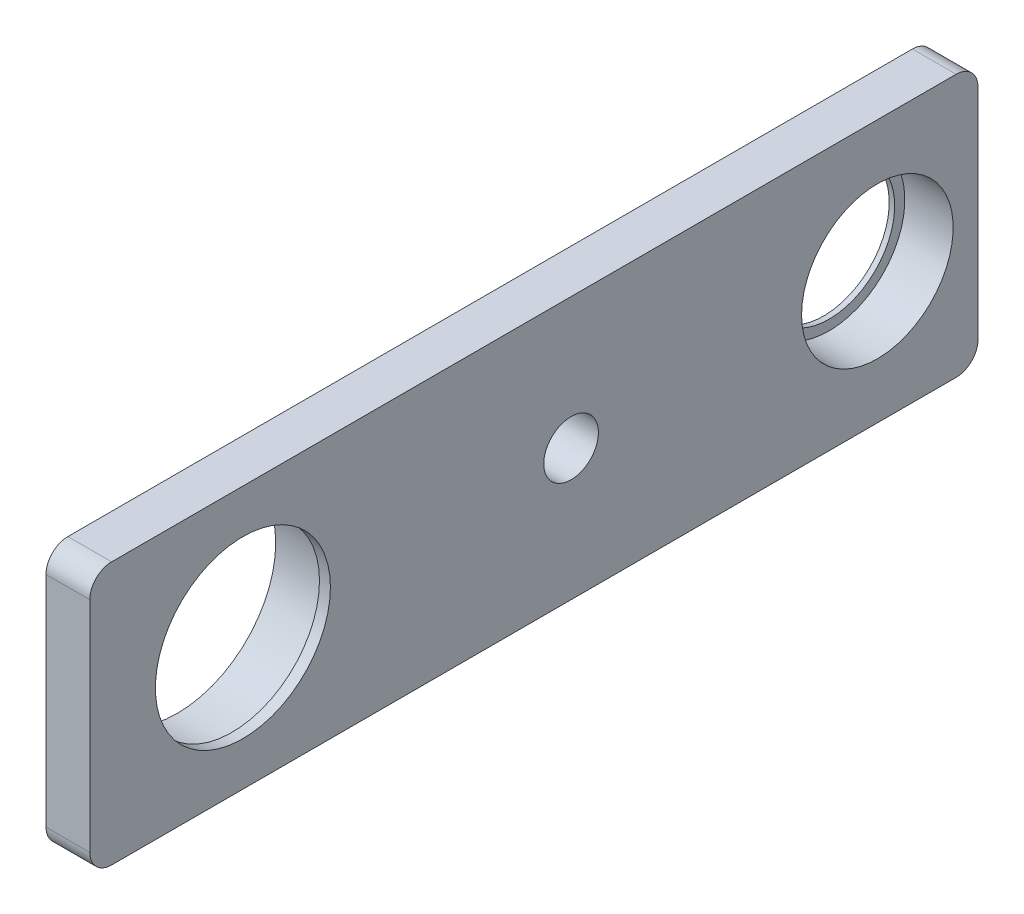
ISO-10303-21;
HEADER;
FILE_DESCRIPTION(('STEP AP214'),'2;1');
FILE_NAME('part.step','',(''),(''),'','','');
FILE_SCHEMA(('AUTOMOTIVE_DESIGN { 1 0 10303 214 1 1 1 1 }'));
ENDSEC;
DATA;
#1=APPLICATION_CONTEXT('core data for automotive mechanical design processes');
#2=APPLICATION_PROTOCOL_DEFINITION('international standard','automotive_design',2000,#1);
#3=PRODUCT_CONTEXT('',#1,'mechanical');
#4=PRODUCT('Part','Part','',(#3));
#5=PRODUCT_RELATED_PRODUCT_CATEGORY('part','',(#4));
#6=PRODUCT_DEFINITION_FORMATION('','',#4);
#7=PRODUCT_DEFINITION_CONTEXT('part definition',#1,'design');
#8=PRODUCT_DEFINITION('design','',#6,#7);
#9=PRODUCT_DEFINITION_SHAPE('','',#8);
#10=(LENGTH_UNIT() NAMED_UNIT(*) SI_UNIT(.MILLI.,.METRE.));
#11=(NAMED_UNIT(*) PLANE_ANGLE_UNIT() SI_UNIT($,.RADIAN.));
#12=(NAMED_UNIT(*) SI_UNIT($,.STERADIAN.) SOLID_ANGLE_UNIT());
#13=UNCERTAINTY_MEASURE_WITH_UNIT(LENGTH_MEASURE(1.E-05),#10,'distance_accuracy_value','');
#14=(GEOMETRIC_REPRESENTATION_CONTEXT(3) GLOBAL_UNCERTAINTY_ASSIGNED_CONTEXT((#13)) GLOBAL_UNIT_ASSIGNED_CONTEXT((#10,
#11,#12)) REPRESENTATION_CONTEXT('',''));
#15=CARTESIAN_POINT('',(0.,0.,0.));
#16=DIRECTION('',(0.,0.,1.));
#17=DIRECTION('',(1.,0.,0.));
#18=AXIS2_PLACEMENT_3D('',#15,#16,#17);
#19=CARTESIAN_POINT('',(0.,0.,0.));
#20=DIRECTION('',(-1.,0.,0.));
#21=DIRECTION('',(0.,0.,1.));
#22=AXIS2_PLACEMENT_3D('',#19,#20,#21);
#23=PLANE('',#22);
#24=CARTESIAN_POINT('',(0.,19.05,-22.225));
#25=DIRECTION('',(-1.,0.,0.));
#26=DIRECTION('',(0.,0.,1.));
#27=AXIS2_PLACEMENT_3D('',#24,#25,#26);
#28=CIRCLE('',#27,15.875);
#29=CARTESIAN_POINT('',(0.,19.05,-6.35));
#30=VERTEX_POINT('',#29);
#31=EDGE_CURVE('E170',#30,#30,#28,.T.);
#32=ORIENTED_EDGE('',*,*,#31,.F.);
#33=EDGE_LOOP('',(#32));
#34=FACE_BOUND('',#33,.T.);
#35=CARTESIAN_POINT('',(0.,19.05,-69.85));
#36=DIRECTION('',(1.,0.,0.));
#37=DIRECTION('',(0.,0.,-1.));
#38=AXIS2_PLACEMENT_3D('',#35,#36,#37);
#39=CIRCLE('',#38,3.96874999999999);
#40=CARTESIAN_POINT('',(0.,19.05,-73.81875));
#41=VERTEX_POINT('',#40);
#42=EDGE_CURVE('E190',#41,#41,#39,.T.);
#43=ORIENTED_EDGE('',*,*,#42,.T.);
#44=EDGE_LOOP('',(#43));
#45=FACE_BOUND('',#44,.T.);
#46=DIRECTION('',(0.,0.,-1.));
#47=VECTOR('',#46,1.);
#48=CARTESIAN_POINT('',(0.,0.,0.));
#49=LINE('',#48,#47);
#50=CARTESIAN_POINT('',(0.,0.,-3.175));
#51=VERTEX_POINT('',#50);
#52=CARTESIAN_POINT('',(0.,0.,-125.73));
#53=VERTEX_POINT('',#52);
#54=EDGE_CURVE('E116',#51,#53,#49,.T.);
#55=ORIENTED_EDGE('',*,*,#54,.F.);
#56=CARTESIAN_POINT('',(0.,3.175,-3.175));
#57=DIRECTION('',(-1.,0.,0.));
#58=DIRECTION('',(0.,0.,1.));
#59=AXIS2_PLACEMENT_3D('',#56,#57,#58);
#60=CIRCLE('',#59,3.175);
#61=CARTESIAN_POINT('',(0.,3.175,0.));
#62=VERTEX_POINT('',#61);
#63=EDGE_CURVE('E99',#51,#62,#60,.T.);
#64=ORIENTED_EDGE('',*,*,#63,.T.);
#65=DIRECTION('',(0.,-1.,0.));
#66=VECTOR('',#65,1.);
#67=CARTESIAN_POINT('',(0.,0.,0.));
#68=LINE('',#67,#66);
#69=CARTESIAN_POINT('',(0.,34.925,0.));
#70=VERTEX_POINT('',#69);
#71=EDGE_CURVE('E127',#70,#62,#68,.T.);
#72=ORIENTED_EDGE('',*,*,#71,.F.);
#73=CARTESIAN_POINT('',(0.,34.925,-3.175));
#74=DIRECTION('',(-1.,0.,0.));
#75=DIRECTION('',(0.,0.,1.));
#76=AXIS2_PLACEMENT_3D('',#73,#74,#75);
#77=CIRCLE('',#76,3.175);
#78=CARTESIAN_POINT('',(0.,38.1,-3.175));
#79=VERTEX_POINT('',#78);
#80=EDGE_CURVE('E110',#70,#79,#77,.T.);
#81=ORIENTED_EDGE('',*,*,#80,.T.);
#82=DIRECTION('',(0.,0.,1.));
#83=VECTOR('',#82,1.);
#84=CARTESIAN_POINT('',(0.,38.1,0.));
#85=LINE('',#84,#83);
#86=CARTESIAN_POINT('',(0.,38.1,-125.73));
#87=VERTEX_POINT('',#86);
#88=EDGE_CURVE('E126',#87,#79,#85,.T.);
#89=ORIENTED_EDGE('',*,*,#88,.F.);
#90=CARTESIAN_POINT('',(0.,34.925,-125.73));
#91=DIRECTION('',(-1.,0.,0.));
#92=DIRECTION('',(0.,0.,1.));
#93=AXIS2_PLACEMENT_3D('',#90,#91,#92);
#94=CIRCLE('',#93,3.175);
#95=CARTESIAN_POINT('',(0.,34.925,-128.905));
#96=VERTEX_POINT('',#95);
#97=EDGE_CURVE('E120',#87,#96,#94,.T.);
#98=ORIENTED_EDGE('',*,*,#97,.T.);
#99=DIRECTION('',(0.,1.,0.));
#100=VECTOR('',#99,1.);
#101=CARTESIAN_POINT('',(0.,0.,-128.905));
#102=LINE('',#101,#100);
#103=CARTESIAN_POINT('',(0.,3.175,-128.905));
#104=VERTEX_POINT('',#103);
#105=EDGE_CURVE('E160',#104,#96,#102,.T.);
#106=ORIENTED_EDGE('',*,*,#105,.F.);
#107=CARTESIAN_POINT('',(0.,3.175,-125.73));
#108=DIRECTION('',(-1.,0.,0.));
#109=DIRECTION('',(0.,0.,1.));
#110=AXIS2_PLACEMENT_3D('',#107,#108,#109);
#111=CIRCLE('',#110,3.175);
#112=EDGE_CURVE('E125',#104,#53,#111,.T.);
#113=ORIENTED_EDGE('',*,*,#112,.T.);
#114=EDGE_LOOP('',(#55,#64,#72,#81,#89,#98,#106,#113));
#115=FACE_BOUND('',#114,.T.);
#116=CARTESIAN_POINT('',(0.,19.05,-114.3));
#117=DIRECTION('',(-1.,0.,0.));
#118=DIRECTION('',(0.,0.,1.));
#119=AXIS2_PLACEMENT_3D('',#116,#117,#118);
#120=CIRCLE('',#119,12.7);
#121=CARTESIAN_POINT('',(0.,19.05,-101.6));
#122=VERTEX_POINT('',#121);
#123=EDGE_CURVE('E333',#122,#122,#120,.T.);
#124=ORIENTED_EDGE('',*,*,#123,.F.);
#125=EDGE_LOOP('',(#124));
#126=FACE_BOUND('',#125,.T.);
#127=ADVANCED_FACE('F33',(#34,#45,#115,#126),#23,.T.);
#128=CARTESIAN_POINT('',(6.35,19.05,-22.225));
#129=DIRECTION('',(-1.,0.,0.));
#130=DIRECTION('',(0.,0.,1.));
#131=AXIS2_PLACEMENT_3D('',#128,#129,#130);
#132=CYLINDRICAL_SURFACE('',#131,14.2875);
#133=CARTESIAN_POINT('',(4.7625,19.05,-22.225));
#134=DIRECTION('',(1.,0.,0.));
#135=DIRECTION('',(0.,0.,-1.));
#136=AXIS2_PLACEMENT_3D('',#133,#134,#135);
#137=CIRCLE('',#136,14.2875);
#138=CARTESIAN_POINT('',(4.7625,19.05,-36.5125));
#139=VERTEX_POINT('',#138);
#140=EDGE_CURVE('E185',#139,#139,#137,.T.);
#141=ORIENTED_EDGE('',*,*,#140,.T.);
#142=EDGE_LOOP('',(#141));
#143=FACE_BOUND('',#142,.T.);
#144=CARTESIAN_POINT('',(-3.175,19.05,-22.225));
#145=DIRECTION('',(-1.,0.,0.));
#146=DIRECTION('',(0.,0.,1.));
#147=AXIS2_PLACEMENT_3D('',#144,#145,#146);
#148=CIRCLE('',#147,14.2875);
#149=CARTESIAN_POINT('',(-3.175,19.05,-7.93749999999999));
#150=VERTEX_POINT('',#149);
#151=EDGE_CURVE('E167',#150,#150,#148,.T.);
#152=ORIENTED_EDGE('',*,*,#151,.T.);
#153=EDGE_LOOP('',(#152));
#154=FACE_BOUND('',#153,.T.);
#155=ADVANCED_FACE('F218',(#143,#154),#132,.F.);
#156=CARTESIAN_POINT('',(6.35,0.,0.));
#157=DIRECTION('',(-1.,0.,0.));
#158=DIRECTION('',(0.,0.,1.));
#159=AXIS2_PLACEMENT_3D('',#156,#157,#158);
#160=PLANE('',#159);
#161=CARTESIAN_POINT('',(6.35,19.05,-114.3));
#162=DIRECTION('',(-1.,0.,0.));
#163=DIRECTION('',(0.,0.,1.));
#164=AXIS2_PLACEMENT_3D('',#161,#162,#163);
#165=CIRCLE('',#164,11.);
#166=CARTESIAN_POINT('',(6.35,19.05,-103.3));
#167=VERTEX_POINT('',#166);
#168=EDGE_CURVE('E172',#167,#167,#165,.F.);
#169=ORIENTED_EDGE('',*,*,#168,.F.);
#170=EDGE_LOOP('',(#169));
#171=FACE_BOUND('',#170,.T.);
#172=DIRECTION('',(0.,-1.,0.));
#173=VECTOR('',#172,1.);
#174=CARTESIAN_POINT('',(6.35,0.,0.));
#175=LINE('',#174,#173);
#176=CARTESIAN_POINT('',(6.35,34.925,0.));
#177=VERTEX_POINT('',#176);
#178=CARTESIAN_POINT('',(6.35,3.175,0.));
#179=VERTEX_POINT('',#178);
#180=EDGE_CURVE('E129',#177,#179,#175,.T.);
#181=ORIENTED_EDGE('',*,*,#180,.T.);
#182=CARTESIAN_POINT('',(6.35,3.175,-3.175));
#183=DIRECTION('',(-1.,0.,0.));
#184=DIRECTION('',(0.,0.,1.));
#185=AXIS2_PLACEMENT_3D('',#182,#183,#184);
#186=CIRCLE('',#185,3.175);
#187=CARTESIAN_POINT('',(6.35,0.,-3.175));
#188=VERTEX_POINT('',#187);
#189=EDGE_CURVE('E148',#179,#188,#186,.F.);
#190=ORIENTED_EDGE('',*,*,#189,.T.);
#191=DIRECTION('',(0.,0.,-1.));
#192=VECTOR('',#191,1.);
#193=CARTESIAN_POINT('',(6.35,0.,0.));
#194=LINE('',#193,#192);
#195=CARTESIAN_POINT('',(6.35,0.,-125.73));
#196=VERTEX_POINT('',#195);
#197=EDGE_CURVE('E119',#188,#196,#194,.T.);
#198=ORIENTED_EDGE('',*,*,#197,.T.);
#199=CARTESIAN_POINT('',(6.35,3.175,-125.73));
#200=DIRECTION('',(-1.,0.,0.));
#201=DIRECTION('',(0.,0.,1.));
#202=AXIS2_PLACEMENT_3D('',#199,#200,#201);
#203=CIRCLE('',#202,3.175);
#204=CARTESIAN_POINT('',(6.35,3.17500000000001,-128.905));
#205=VERTEX_POINT('',#204);
#206=EDGE_CURVE('E144',#196,#205,#203,.F.);
#207=ORIENTED_EDGE('',*,*,#206,.T.);
#208=DIRECTION('',(0.,-1.,0.));
#209=VECTOR('',#208,1.);
#210=CARTESIAN_POINT('',(6.35,38.1,-128.905));
#211=LINE('',#210,#209);
#212=CARTESIAN_POINT('',(6.35,34.925,-128.905));
#213=VERTEX_POINT('',#212);
#214=EDGE_CURVE('E158',#213,#205,#211,.T.);
#215=ORIENTED_EDGE('',*,*,#214,.F.);
#216=CARTESIAN_POINT('',(6.35,34.925,-125.73));
#217=DIRECTION('',(-1.,0.,0.));
#218=DIRECTION('',(0.,0.,1.));
#219=AXIS2_PLACEMENT_3D('',#216,#217,#218);
#220=CIRCLE('',#219,3.175);
#221=CARTESIAN_POINT('',(6.35,38.1,-125.73));
#222=VERTEX_POINT('',#221);
#223=EDGE_CURVE('E55',#213,#222,#220,.F.);
#224=ORIENTED_EDGE('',*,*,#223,.T.);
#225=DIRECTION('',(0.,0.,1.));
#226=VECTOR('',#225,1.);
#227=CARTESIAN_POINT('',(6.35,38.1,0.));
#228=LINE('',#227,#226);
#229=CARTESIAN_POINT('',(6.35,38.1,-3.175));
#230=VERTEX_POINT('',#229);
#231=EDGE_CURVE('E135',#222,#230,#228,.T.);
#232=ORIENTED_EDGE('',*,*,#231,.T.);
#233=CARTESIAN_POINT('',(6.35,34.925,-3.175));
#234=DIRECTION('',(-1.,0.,0.));
#235=DIRECTION('',(0.,0.,1.));
#236=AXIS2_PLACEMENT_3D('',#233,#234,#235);
#237=CIRCLE('',#236,3.175);
#238=EDGE_CURVE('E146',#230,#177,#237,.F.);
#239=ORIENTED_EDGE('',*,*,#238,.T.);
#240=EDGE_LOOP('',(#181,#190,#198,#207,#215,#224,#232,#239));
#241=FACE_BOUND('',#240,.T.);
#242=CARTESIAN_POINT('',(6.35,19.05,-69.85));
#243=DIRECTION('',(1.,0.,0.));
#244=DIRECTION('',(0.,0.,-1.));
#245=AXIS2_PLACEMENT_3D('',#242,#243,#244);
#246=CIRCLE('',#245,3.96874999999999);
#247=CARTESIAN_POINT('',(6.35,19.05,-73.81875));
#248=VERTEX_POINT('',#247);
#249=EDGE_CURVE('E131',#248,#248,#246,.T.);
#250=ORIENTED_EDGE('',*,*,#249,.F.);
#251=EDGE_LOOP('',(#250));
#252=FACE_BOUND('',#251,.T.);
#253=CARTESIAN_POINT('',(6.35,19.05,-22.225));
#254=DIRECTION('',(1.,0.,0.));
#255=DIRECTION('',(0.,0.,-1.));
#256=AXIS2_PLACEMENT_3D('',#253,#254,#255);
#257=CIRCLE('',#256,12.7);
#258=CARTESIAN_POINT('',(6.35,19.05,-34.925));
#259=VERTEX_POINT('',#258);
#260=EDGE_CURVE('E179',#259,#259,#257,.T.);
#261=ORIENTED_EDGE('',*,*,#260,.F.);
#262=EDGE_LOOP('',(#261));
#263=FACE_BOUND('',#262,.T.);
#264=ADVANCED_FACE('F164',(#171,#241,#252,#263),#160,.F.);
#265=CARTESIAN_POINT('',(6.35,0.,0.));
#266=DIRECTION('',(0.,0.,-1.));
#267=DIRECTION('',(-1.,0.,0.));
#268=AXIS2_PLACEMENT_3D('',#265,#266,#267);
#269=PLANE('',#268);
#270=ORIENTED_EDGE('',*,*,#71,.T.);
#271=DIRECTION('',(-1.,0.,0.));
#272=VECTOR('',#271,1.);
#273=CARTESIAN_POINT('',(6.35,3.175,0.));
#274=LINE('',#273,#272);
#275=EDGE_CURVE('E104',#62,#179,#274,.F.);
#276=ORIENTED_EDGE('',*,*,#275,.T.);
#277=ORIENTED_EDGE('',*,*,#180,.F.);
#278=DIRECTION('',(-1.,0.,0.));
#279=VECTOR('',#278,1.);
#280=CARTESIAN_POINT('',(6.35,34.925,0.));
#281=LINE('',#280,#279);
#282=EDGE_CURVE('E109',#177,#70,#281,.T.);
#283=ORIENTED_EDGE('',*,*,#282,.T.);
#284=EDGE_LOOP('',(#270,#276,#277,#283));
#285=FACE_BOUND('',#284,.T.);
#286=ADVANCED_FACE('F203',(#285),#269,.F.);
#287=CARTESIAN_POINT('',(6.35,0.,0.));
#288=DIRECTION('',(0.,1.,0.));
#289=DIRECTION('',(0.,0.,1.));
#290=AXIS2_PLACEMENT_3D('',#287,#288,#289);
#291=PLANE('',#290);
#292=ORIENTED_EDGE('',*,*,#197,.F.);
#293=DIRECTION('',(-1.,0.,0.));
#294=VECTOR('',#293,1.);
#295=CARTESIAN_POINT('',(6.35,0.,-3.175));
#296=LINE('',#295,#294);
#297=EDGE_CURVE('E103',#188,#51,#296,.T.);
#298=ORIENTED_EDGE('',*,*,#297,.T.);
#299=ORIENTED_EDGE('',*,*,#54,.T.);
#300=DIRECTION('',(-1.,0.,0.));
#301=VECTOR('',#300,1.);
#302=CARTESIAN_POINT('',(6.35,0.,-125.73));
#303=LINE('',#302,#301);
#304=EDGE_CURVE('E121',#53,#196,#303,.F.);
#305=ORIENTED_EDGE('',*,*,#304,.T.);
#306=EDGE_LOOP('',(#292,#298,#299,#305));
#307=FACE_BOUND('',#306,.T.);
#308=ADVANCED_FACE('F115',(#307),#291,.F.);
#309=CARTESIAN_POINT('',(6.35,38.1,0.));
#310=DIRECTION('',(0.,-1.,0.));
#311=DIRECTION('',(0.,0.,-1.));
#312=AXIS2_PLACEMENT_3D('',#309,#310,#311);
#313=PLANE('',#312);
#314=ORIENTED_EDGE('',*,*,#88,.T.);
#315=DIRECTION('',(-1.,0.,0.));
#316=VECTOR('',#315,1.);
#317=CARTESIAN_POINT('',(6.35,38.1,-3.175));
#318=LINE('',#317,#316);
#319=EDGE_CURVE('E48',#79,#230,#318,.F.);
#320=ORIENTED_EDGE('',*,*,#319,.T.);
#321=ORIENTED_EDGE('',*,*,#231,.F.);
#322=DIRECTION('',(1.,0.,0.));
#323=VECTOR('',#322,1.);
#324=CARTESIAN_POINT('',(0.,38.1,-125.73));
#325=LINE('',#324,#323);
#326=EDGE_CURVE('E150',#222,#87,#325,.F.);
#327=ORIENTED_EDGE('',*,*,#326,.T.);
#328=EDGE_LOOP('',(#314,#320,#321,#327));
#329=FACE_BOUND('',#328,.T.);
#330=ADVANCED_FACE('F205',(#329),#313,.F.);
#331=CARTESIAN_POINT('',(6.35,19.05,-69.85));
#332=DIRECTION('',(-1.,0.,0.));
#333=DIRECTION('',(0.,0.,1.));
#334=AXIS2_PLACEMENT_3D('',#331,#332,#333);
#335=CYLINDRICAL_SURFACE('',#334,3.96874999999999);
#336=ORIENTED_EDGE('',*,*,#249,.T.);
#337=EDGE_LOOP('',(#336));
#338=FACE_BOUND('',#337,.T.);
#339=ORIENTED_EDGE('',*,*,#42,.F.);
#340=EDGE_LOOP('',(#339));
#341=FACE_BOUND('',#340,.T.);
#342=ADVANCED_FACE('F232',(#338,#341),#335,.F.);
#343=CARTESIAN_POINT('',(4.7625,19.05,-22.225));
#344=DIRECTION('',(1.,0.,0.));
#345=DIRECTION('',(0.,0.,-1.));
#346=AXIS2_PLACEMENT_3D('',#343,#344,#345);
#347=PLANE('',#346);
#348=CARTESIAN_POINT('',(4.7625,19.05,-22.225));
#349=DIRECTION('',(1.,0.,0.));
#350=DIRECTION('',(0.,0.,-1.));
#351=AXIS2_PLACEMENT_3D('',#348,#349,#350);
#352=CIRCLE('',#351,12.7);
#353=CARTESIAN_POINT('',(4.7625,19.05,-34.925));
#354=VERTEX_POINT('',#353);
#355=EDGE_CURVE('E182',#354,#354,#352,.T.);
#356=ORIENTED_EDGE('',*,*,#355,.T.);
#357=EDGE_LOOP('',(#356));
#358=FACE_BOUND('',#357,.T.);
#359=ORIENTED_EDGE('',*,*,#140,.F.);
#360=EDGE_LOOP('',(#359));
#361=FACE_BOUND('',#360,.T.);
#362=ADVANCED_FACE('F312',(#358,#361),#347,.F.);
#363=CARTESIAN_POINT('',(4.7625,19.05,-22.225));
#364=DIRECTION('',(1.,0.,0.));
#365=DIRECTION('',(0.,0.,-1.));
#366=AXIS2_PLACEMENT_3D('',#363,#364,#365);
#367=CYLINDRICAL_SURFACE('',#366,12.7);
#368=ORIENTED_EDGE('',*,*,#355,.F.);
#369=EDGE_LOOP('',(#368));
#370=FACE_BOUND('',#369,.T.);
#371=ORIENTED_EDGE('',*,*,#260,.T.);
#372=EDGE_LOOP('',(#371));
#373=FACE_BOUND('',#372,.T.);
#374=ADVANCED_FACE('F305',(#370,#373),#367,.F.);
#375=CARTESIAN_POINT('',(-3.175,19.05,-22.225));
#376=DIRECTION('',(-1.,0.,0.));
#377=DIRECTION('',(0.,0.,1.));
#378=AXIS2_PLACEMENT_3D('',#375,#376,#377);
#379=PLANE('',#378);
#380=CARTESIAN_POINT('',(-3.175,19.05,-22.225));
#381=DIRECTION('',(-1.,0.,0.));
#382=DIRECTION('',(0.,0.,1.));
#383=AXIS2_PLACEMENT_3D('',#380,#381,#382);
#384=CIRCLE('',#383,15.875);
#385=CARTESIAN_POINT('',(-3.175,19.05,-6.35));
#386=VERTEX_POINT('',#385);
#387=EDGE_CURVE('E176',#386,#386,#384,.T.);
#388=ORIENTED_EDGE('',*,*,#387,.T.);
#389=EDGE_LOOP('',(#388));
#390=FACE_BOUND('',#389,.T.);
#391=ORIENTED_EDGE('',*,*,#151,.F.);
#392=EDGE_LOOP('',(#391));
#393=FACE_BOUND('',#392,.T.);
#394=ADVANCED_FACE('F302',(#390,#393),#379,.T.);
#395=CARTESIAN_POINT('',(-3.175,19.05,-22.225));
#396=DIRECTION('',(1.,0.,0.));
#397=DIRECTION('',(0.,0.,-1.));
#398=AXIS2_PLACEMENT_3D('',#395,#396,#397);
#399=CYLINDRICAL_SURFACE('',#398,15.875);
#400=ORIENTED_EDGE('',*,*,#387,.F.);
#401=EDGE_LOOP('',(#400));
#402=FACE_BOUND('',#401,.T.);
#403=ORIENTED_EDGE('',*,*,#31,.T.);
#404=EDGE_LOOP('',(#403));
#405=FACE_BOUND('',#404,.T.);
#406=ADVANCED_FACE('F301',(#402,#405),#399,.T.);
#407=CARTESIAN_POINT('',(0.,0.,-128.905));
#408=DIRECTION('',(0.,0.,-1.));
#409=DIRECTION('',(-1.,0.,0.));
#410=AXIS2_PLACEMENT_3D('',#407,#408,#409);
#411=PLANE('',#410);
#412=ORIENTED_EDGE('',*,*,#214,.T.);
#413=DIRECTION('',(-1.,0.,0.));
#414=VECTOR('',#413,1.);
#415=CARTESIAN_POINT('',(0.,3.175,-128.905));
#416=LINE('',#415,#414);
#417=EDGE_CURVE('E11',#205,#104,#416,.T.);
#418=ORIENTED_EDGE('',*,*,#417,.T.);
#419=ORIENTED_EDGE('',*,*,#105,.T.);
#420=DIRECTION('',(1.,0.,0.));
#421=VECTOR('',#420,1.);
#422=CARTESIAN_POINT('',(6.35,34.925,-128.905));
#423=LINE('',#422,#421);
#424=EDGE_CURVE('E41',#96,#213,#423,.T.);
#425=ORIENTED_EDGE('',*,*,#424,.T.);
#426=EDGE_LOOP('',(#412,#418,#419,#425));
#427=FACE_BOUND('',#426,.T.);
#428=ADVANCED_FACE('F157',(#427),#411,.T.);
#429=CARTESIAN_POINT('',(6.351,19.05,-114.3));
#430=DIRECTION('',(-1.,0.,0.));
#431=DIRECTION('',(0.,0.,1.));
#432=AXIS2_PLACEMENT_3D('',#429,#430,#431);
#433=CYLINDRICAL_SURFACE('',#432,11.);
#434=ORIENTED_EDGE('',*,*,#168,.T.);
#435=EDGE_LOOP('',(#434));
#436=FACE_BOUND('',#435,.T.);
#437=CARTESIAN_POINT('',(-0.6604,19.05,-114.3));
#438=DIRECTION('',(-1.,0.,0.));
#439=DIRECTION('',(0.,0.,1.));
#440=AXIS2_PLACEMENT_3D('',#437,#438,#439);
#441=CIRCLE('',#440,11.);
#442=CARTESIAN_POINT('',(-0.6604,19.05,-103.3));
#443=VERTEX_POINT('',#442);
#444=EDGE_CURVE('E335',#443,#443,#441,.T.);
#445=ORIENTED_EDGE('',*,*,#444,.T.);
#446=EDGE_LOOP('',(#445));
#447=FACE_BOUND('',#446,.T.);
#448=ADVANCED_FACE('F262',(#436,#447),#433,.F.);
#449=CARTESIAN_POINT('',(-0.6604,19.05,-114.3));
#450=DIRECTION('',(1.,0.,0.));
#451=DIRECTION('',(0.,0.,-1.));
#452=AXIS2_PLACEMENT_3D('',#449,#450,#451);
#453=CYLINDRICAL_SURFACE('',#452,12.7);
#454=ORIENTED_EDGE('',*,*,#123,.T.);
#455=EDGE_LOOP('',(#454));
#456=FACE_BOUND('',#455,.T.);
#457=CARTESIAN_POINT('',(-1.45415,19.05,-114.3));
#458=DIRECTION('',(-1.,0.,0.));
#459=DIRECTION('',(0.,0.,1.));
#460=AXIS2_PLACEMENT_3D('',#457,#458,#459);
#461=CIRCLE('',#460,12.7);
#462=CARTESIAN_POINT('',(-1.45415,19.05,-101.6));
#463=VERTEX_POINT('',#462);
#464=EDGE_CURVE('E340',#463,#463,#461,.T.);
#465=ORIENTED_EDGE('',*,*,#464,.F.);
#466=EDGE_LOOP('',(#465));
#467=FACE_BOUND('',#466,.T.);
#468=ADVANCED_FACE('F239',(#456,#467),#453,.T.);
#469=CARTESIAN_POINT('',(6.35,3.175,-3.175));
#470=DIRECTION('',(-1.,0.,0.));
#471=DIRECTION('',(0.,0.,1.));
#472=AXIS2_PLACEMENT_3D('',#469,#470,#471);
#473=CYLINDRICAL_SURFACE('',#472,3.175);
#474=ORIENTED_EDGE('',*,*,#189,.F.);
#475=ORIENTED_EDGE('',*,*,#275,.F.);
#476=ORIENTED_EDGE('',*,*,#63,.F.);
#477=ORIENTED_EDGE('',*,*,#297,.F.);
#478=EDGE_LOOP('',(#474,#475,#476,#477));
#479=FACE_BOUND('',#478,.T.);
#480=ADVANCED_FACE('F102',(#479),#473,.T.);
#481=CARTESIAN_POINT('',(6.35,34.925,-3.175));
#482=DIRECTION('',(-1.,0.,0.));
#483=DIRECTION('',(0.,0.,1.));
#484=AXIS2_PLACEMENT_3D('',#481,#482,#483);
#485=CYLINDRICAL_SURFACE('',#484,3.175);
#486=ORIENTED_EDGE('',*,*,#238,.F.);
#487=ORIENTED_EDGE('',*,*,#319,.F.);
#488=ORIENTED_EDGE('',*,*,#80,.F.);
#489=ORIENTED_EDGE('',*,*,#282,.F.);
#490=EDGE_LOOP('',(#486,#487,#488,#489));
#491=FACE_BOUND('',#490,.T.);
#492=ADVANCED_FACE('F201',(#491),#485,.T.);
#493=CARTESIAN_POINT('',(0.,3.175,-125.73));
#494=DIRECTION('',(1.,0.,0.));
#495=DIRECTION('',(0.,0.,-1.));
#496=AXIS2_PLACEMENT_3D('',#493,#494,#495);
#497=CYLINDRICAL_SURFACE('',#496,3.175);
#498=ORIENTED_EDGE('',*,*,#206,.F.);
#499=ORIENTED_EDGE('',*,*,#304,.F.);
#500=ORIENTED_EDGE('',*,*,#112,.F.);
#501=ORIENTED_EDGE('',*,*,#417,.F.);
#502=EDGE_LOOP('',(#498,#499,#500,#501));
#503=FACE_BOUND('',#502,.T.);
#504=ADVANCED_FACE('F208',(#503),#497,.T.);
#505=CARTESIAN_POINT('',(0.,34.925,-125.73));
#506=DIRECTION('',(-1.,0.,0.));
#507=DIRECTION('',(0.,0.,1.));
#508=AXIS2_PLACEMENT_3D('',#505,#506,#507);
#509=CYLINDRICAL_SURFACE('',#508,3.175);
#510=ORIENTED_EDGE('',*,*,#97,.F.);
#511=ORIENTED_EDGE('',*,*,#326,.F.);
#512=ORIENTED_EDGE('',*,*,#223,.F.);
#513=ORIENTED_EDGE('',*,*,#424,.F.);
#514=EDGE_LOOP('',(#510,#511,#512,#513));
#515=FACE_BOUND('',#514,.T.);
#516=ADVANCED_FACE('F35',(#515),#509,.T.);
#517=CARTESIAN_POINT('',(-0.6604,19.05,-114.3));
#518=DIRECTION('',(-1.,0.,0.));
#519=DIRECTION('',(0.,0.,1.));
#520=AXIS2_PLACEMENT_3D('',#517,#518,#519);
#521=PLANE('',#520);
#522=CARTESIAN_POINT('',(-0.6604,19.05,-114.3));
#523=DIRECTION('',(-1.,0.,0.));
#524=DIRECTION('',(0.,0.,1.));
#525=AXIS2_PLACEMENT_3D('',#522,#523,#524);
#526=CIRCLE('',#525,9.52500000000001);
#527=CARTESIAN_POINT('',(-0.6604,19.05,-104.775));
#528=VERTEX_POINT('',#527);
#529=EDGE_CURVE('E344',#528,#528,#526,.T.);
#530=ORIENTED_EDGE('',*,*,#529,.T.);
#531=EDGE_LOOP('',(#530));
#532=FACE_BOUND('',#531,.T.);
#533=ORIENTED_EDGE('',*,*,#444,.F.);
#534=EDGE_LOOP('',(#533));
#535=FACE_BOUND('',#534,.T.);
#536=ADVANCED_FACE('F207',(#532,#535),#521,.F.);
#537=CARTESIAN_POINT('',(-1.45415,19.05,-114.3));
#538=DIRECTION('',(-1.,0.,0.));
#539=DIRECTION('',(0.,0.,1.));
#540=AXIS2_PLACEMENT_3D('',#537,#538,#539);
#541=PLANE('',#540);
#542=ORIENTED_EDGE('',*,*,#464,.T.);
#543=EDGE_LOOP('',(#542));
#544=FACE_BOUND('',#543,.T.);
#545=CARTESIAN_POINT('',(-1.45415,19.05,-114.3));
#546=DIRECTION('',(-1.,0.,0.));
#547=DIRECTION('',(0.,0.,1.));
#548=AXIS2_PLACEMENT_3D('',#545,#546,#547);
#549=CIRCLE('',#548,9.52500000000001);
#550=CARTESIAN_POINT('',(-1.45415,19.05,-104.775));
#551=VERTEX_POINT('',#550);
#552=EDGE_CURVE('E343',#551,#551,#549,.T.);
#553=ORIENTED_EDGE('',*,*,#552,.F.);
#554=EDGE_LOOP('',(#553));
#555=FACE_BOUND('',#554,.T.);
#556=ADVANCED_FACE('F213',(#544,#555),#541,.T.);
#557=CARTESIAN_POINT('',(-1.45415,19.05,-114.3));
#558=DIRECTION('',(1.,0.,0.));
#559=DIRECTION('',(0.,0.,-1.));
#560=AXIS2_PLACEMENT_3D('',#557,#558,#559);
#561=CYLINDRICAL_SURFACE('',#560,9.52500000000001);
#562=ORIENTED_EDGE('',*,*,#552,.T.);
#563=EDGE_LOOP('',(#562));
#564=FACE_BOUND('',#563,.T.);
#565=ORIENTED_EDGE('',*,*,#529,.F.);
#566=EDGE_LOOP('',(#565));
#567=FACE_BOUND('',#566,.T.);
#568=ADVANCED_FACE('F280',(#564,#567),#561,.F.);
#569=CLOSED_SHELL('',(#127,#155,#264,#286,#308,#330,#342,#362,#374,#394,#406,#428,#448,#468,
#480,#492,#504,#516,#536,#556,#568));
#570=MANIFOLD_SOLID_BREP('B2',#569);
#571=ADVANCED_BREP_SHAPE_REPRESENTATION('',(#18,#570),#14);
#572=SHAPE_DEFINITION_REPRESENTATION(#9,#571);
ENDSEC;
END-ISO-10303-21;
